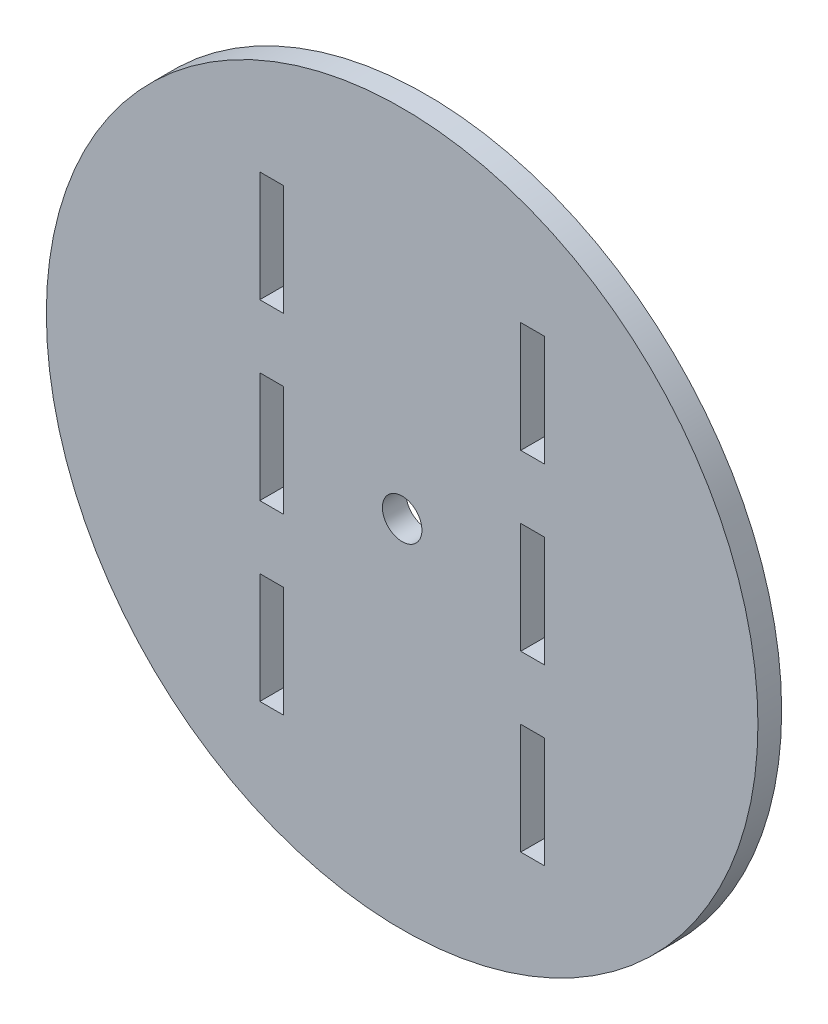
ISO-10303-21;
HEADER;
FILE_DESCRIPTION(('STEP AP214'),'2;1');
FILE_NAME('part.step','',(''),(''),'','','');
FILE_SCHEMA(('AUTOMOTIVE_DESIGN { 1 0 10303 214 1 1 1 1 }'));
ENDSEC;
DATA;
#1=APPLICATION_CONTEXT('core data for automotive mechanical design processes');
#2=APPLICATION_PROTOCOL_DEFINITION('international standard','automotive_design',2000,#1);
#3=PRODUCT_CONTEXT('',#1,'mechanical');
#4=PRODUCT('Part','Part','',(#3));
#5=PRODUCT_RELATED_PRODUCT_CATEGORY('part','',(#4));
#6=PRODUCT_DEFINITION_FORMATION('','',#4);
#7=PRODUCT_DEFINITION_CONTEXT('part definition',#1,'design');
#8=PRODUCT_DEFINITION('design','',#6,#7);
#9=PRODUCT_DEFINITION_SHAPE('','',#8);
#10=(LENGTH_UNIT() NAMED_UNIT(*) SI_UNIT(.MILLI.,.METRE.));
#11=(NAMED_UNIT(*) PLANE_ANGLE_UNIT() SI_UNIT($,.RADIAN.));
#12=(NAMED_UNIT(*) SI_UNIT($,.STERADIAN.) SOLID_ANGLE_UNIT());
#13=UNCERTAINTY_MEASURE_WITH_UNIT(LENGTH_MEASURE(1.E-05),#10,'distance_accuracy_value','');
#14=(GEOMETRIC_REPRESENTATION_CONTEXT(3) GLOBAL_UNCERTAINTY_ASSIGNED_CONTEXT((#13)) GLOBAL_UNIT_ASSIGNED_CONTEXT((#10,
#11,#12)) REPRESENTATION_CONTEXT('',''));
#15=CARTESIAN_POINT('',(0.,0.,0.));
#16=DIRECTION('',(0.,0.,1.));
#17=DIRECTION('',(1.,0.,0.));
#18=AXIS2_PLACEMENT_3D('',#15,#16,#17);
#19=CARTESIAN_POINT('',(45.,147.508099700188,3.));
#20=DIRECTION('',(0.,0.,1.));
#21=DIRECTION('',(1.,0.,0.));
#22=AXIS2_PLACEMENT_3D('',#19,#20,#21);
#23=PLANE('',#22);
#24=CARTESIAN_POINT('',(45.,147.508099700188,3.));
#25=DIRECTION('',(0.,0.,1.));
#26=DIRECTION('',(1.,0.,0.));
#27=AXIS2_PLACEMENT_3D('',#24,#25,#26);
#28=CIRCLE('',#27,45.);
#29=CARTESIAN_POINT('',(90.,147.508099700188,3.));
#30=VERTEX_POINT('',#29);
#31=EDGE_CURVE('E11',#30,#30,#28,.T.);
#32=ORIENTED_EDGE('',*,*,#31,.T.);
#33=EDGE_LOOP('',(#32));
#34=FACE_BOUND('',#33,.T.);
#35=DIRECTION('',(-1.,0.,0.));
#36=VECTOR('',#35,1.);
#37=CARTESIAN_POINT('',(45.,176.508099700188,3.));
#38=LINE('',#37,#36);
#39=CARTESIAN_POINT('',(63.,176.508099700188,3.));
#40=VERTEX_POINT('',#39);
#41=CARTESIAN_POINT('',(60.,176.508099700188,3.));
#42=VERTEX_POINT('',#41);
#43=EDGE_CURVE('E382',#40,#42,#38,.T.);
#44=ORIENTED_EDGE('',*,*,#43,.F.);
#45=DIRECTION('',(0.,1.,0.));
#46=VECTOR('',#45,1.);
#47=CARTESIAN_POINT('',(63.,147.508099700188,3.));
#48=LINE('',#47,#46);
#49=CARTESIAN_POINT('',(63.,162.508099700188,3.));
#50=VERTEX_POINT('',#49);
#51=EDGE_CURVE('E368',#50,#40,#48,.T.);
#52=ORIENTED_EDGE('',*,*,#51,.F.);
#53=DIRECTION('',(-1.,0.,0.));
#54=VECTOR('',#53,1.);
#55=CARTESIAN_POINT('',(45.,162.508099700188,3.));
#56=LINE('',#55,#54);
#57=CARTESIAN_POINT('',(60.,162.508099700188,3.));
#58=VERTEX_POINT('',#57);
#59=EDGE_CURVE('E376',#50,#58,#56,.T.);
#60=ORIENTED_EDGE('',*,*,#59,.T.);
#61=DIRECTION('',(0.,1.,0.));
#62=VECTOR('',#61,1.);
#63=CARTESIAN_POINT('',(60.,147.508099700188,3.));
#64=LINE('',#63,#62);
#65=EDGE_CURVE('E379',#58,#42,#64,.T.);
#66=ORIENTED_EDGE('',*,*,#65,.T.);
#67=EDGE_LOOP('',(#44,#52,#60,#66));
#68=FACE_BOUND('',#67,.T.);
#69=DIRECTION('',(1.,0.,0.));
#70=VECTOR('',#69,1.);
#71=CARTESIAN_POINT('',(45.,140.508099700188,3.));
#72=LINE('',#71,#70);
#73=CARTESIAN_POINT('',(60.,140.508099700188,3.));
#74=VERTEX_POINT('',#73);
#75=CARTESIAN_POINT('',(63.,140.508099700188,3.));
#76=VERTEX_POINT('',#75);
#77=EDGE_CURVE('E352',#74,#76,#72,.T.);
#78=ORIENTED_EDGE('',*,*,#77,.F.);
#79=DIRECTION('',(0.,-1.,0.));
#80=VECTOR('',#79,1.);
#81=CARTESIAN_POINT('',(60.,147.508099700188,3.));
#82=LINE('',#81,#80);
#83=CARTESIAN_POINT('',(60.,154.508099700188,3.));
#84=VERTEX_POINT('',#83);
#85=EDGE_CURVE('E345',#84,#74,#82,.T.);
#86=ORIENTED_EDGE('',*,*,#85,.F.);
#87=DIRECTION('',(-1.,0.,0.));
#88=VECTOR('',#87,1.);
#89=CARTESIAN_POINT('',(45.,154.508099700188,3.));
#90=LINE('',#89,#88);
#91=CARTESIAN_POINT('',(63.,154.508099700188,3.));
#92=VERTEX_POINT('',#91);
#93=EDGE_CURVE('E347',#92,#84,#90,.T.);
#94=ORIENTED_EDGE('',*,*,#93,.F.);
#95=DIRECTION('',(0.,1.,0.));
#96=VECTOR('',#95,1.);
#97=CARTESIAN_POINT('',(63.,147.508099700188,3.));
#98=LINE('',#97,#96);
#99=EDGE_CURVE('E350',#76,#92,#98,.T.);
#100=ORIENTED_EDGE('',*,*,#99,.F.);
#101=EDGE_LOOP('',(#78,#86,#94,#100));
#102=FACE_BOUND('',#101,.T.);
#103=DIRECTION('',(-1.,0.,0.));
#104=VECTOR('',#103,1.);
#105=CARTESIAN_POINT('',(45.,132.508099700188,3.));
#106=LINE('',#105,#104);
#107=CARTESIAN_POINT('',(63.,132.508099700188,3.));
#108=VERTEX_POINT('',#107);
#109=CARTESIAN_POINT('',(60.,132.508099700188,3.));
#110=VERTEX_POINT('',#109);
#111=EDGE_CURVE('E323',#108,#110,#106,.T.);
#112=ORIENTED_EDGE('',*,*,#111,.F.);
#113=DIRECTION('',(0.,1.,0.));
#114=VECTOR('',#113,1.);
#115=CARTESIAN_POINT('',(63.,147.508099700188,3.));
#116=LINE('',#115,#114);
#117=CARTESIAN_POINT('',(63.,118.508099700188,3.));
#118=VERTEX_POINT('',#117);
#119=EDGE_CURVE('E315',#118,#108,#116,.T.);
#120=ORIENTED_EDGE('',*,*,#119,.F.);
#121=DIRECTION('',(1.,0.,0.));
#122=VECTOR('',#121,1.);
#123=CARTESIAN_POINT('',(45.,118.508099700188,3.));
#124=LINE('',#123,#122);
#125=CARTESIAN_POINT('',(60.,118.508099700188,3.));
#126=VERTEX_POINT('',#125);
#127=EDGE_CURVE('E317',#126,#118,#124,.T.);
#128=ORIENTED_EDGE('',*,*,#127,.F.);
#129=DIRECTION('',(0.,1.,0.));
#130=VECTOR('',#129,1.);
#131=CARTESIAN_POINT('',(60.,147.508099700188,3.));
#132=LINE('',#131,#130);
#133=EDGE_CURVE('E320',#126,#110,#132,.T.);
#134=ORIENTED_EDGE('',*,*,#133,.T.);
#135=EDGE_LOOP('',(#112,#120,#128,#134));
#136=FACE_BOUND('',#135,.T.);
#137=DIRECTION('',(-1.,0.,0.));
#138=VECTOR('',#137,1.);
#139=CARTESIAN_POINT('',(45.,176.508099700188,3.));
#140=LINE('',#139,#138);
#141=CARTESIAN_POINT('',(30.,176.508099700188,3.));
#142=VERTEX_POINT('',#141);
#143=CARTESIAN_POINT('',(27.,176.508099700188,3.));
#144=VERTEX_POINT('',#143);
#145=EDGE_CURVE('E293',#142,#144,#140,.T.);
#146=ORIENTED_EDGE('',*,*,#145,.F.);
#147=DIRECTION('',(0.,1.,0.));
#148=VECTOR('',#147,1.);
#149=CARTESIAN_POINT('',(30.,147.508099700188,3.));
#150=LINE('',#149,#148);
#151=CARTESIAN_POINT('',(30.,162.508099700188,3.));
#152=VERTEX_POINT('',#151);
#153=EDGE_CURVE('E286',#152,#142,#150,.T.);
#154=ORIENTED_EDGE('',*,*,#153,.F.);
#155=DIRECTION('',(-1.,0.,0.));
#156=VECTOR('',#155,1.);
#157=CARTESIAN_POINT('',(45.,162.508099700188,3.));
#158=LINE('',#157,#156);
#159=CARTESIAN_POINT('',(27.,162.508099700188,3.));
#160=VERTEX_POINT('',#159);
#161=EDGE_CURVE('E288',#152,#160,#158,.T.);
#162=ORIENTED_EDGE('',*,*,#161,.T.);
#163=DIRECTION('',(0.,-1.,0.));
#164=VECTOR('',#163,1.);
#165=CARTESIAN_POINT('',(27.,147.508099700188,3.));
#166=LINE('',#165,#164);
#167=EDGE_CURVE('E291',#144,#160,#166,.T.);
#168=ORIENTED_EDGE('',*,*,#167,.F.);
#169=EDGE_LOOP('',(#146,#154,#162,#168));
#170=FACE_BOUND('',#169,.T.);
#171=DIRECTION('',(-1.,0.,0.));
#172=VECTOR('',#171,1.);
#173=CARTESIAN_POINT('',(45.,154.508099700188,3.));
#174=LINE('',#173,#172);
#175=CARTESIAN_POINT('',(30.,154.508099700188,3.));
#176=VERTEX_POINT('',#175);
#177=CARTESIAN_POINT('',(27.,154.508099700188,3.));
#178=VERTEX_POINT('',#177);
#179=EDGE_CURVE('E264',#176,#178,#174,.T.);
#180=ORIENTED_EDGE('',*,*,#179,.F.);
#181=DIRECTION('',(0.,1.,0.));
#182=VECTOR('',#181,1.);
#183=CARTESIAN_POINT('',(30.,147.508099700188,3.));
#184=LINE('',#183,#182);
#185=CARTESIAN_POINT('',(30.,140.508099700188,3.));
#186=VERTEX_POINT('',#185);
#187=EDGE_CURVE('E257',#186,#176,#184,.T.);
#188=ORIENTED_EDGE('',*,*,#187,.F.);
#189=DIRECTION('',(1.,0.,0.));
#190=VECTOR('',#189,1.);
#191=CARTESIAN_POINT('',(45.,140.508099700188,3.));
#192=LINE('',#191,#190);
#193=CARTESIAN_POINT('',(27.,140.508099700188,3.));
#194=VERTEX_POINT('',#193);
#195=EDGE_CURVE('E259',#194,#186,#192,.T.);
#196=ORIENTED_EDGE('',*,*,#195,.F.);
#197=DIRECTION('',(0.,-1.,0.));
#198=VECTOR('',#197,1.);
#199=CARTESIAN_POINT('',(27.,147.508099700188,3.));
#200=LINE('',#199,#198);
#201=EDGE_CURVE('E262',#178,#194,#200,.T.);
#202=ORIENTED_EDGE('',*,*,#201,.F.);
#203=EDGE_LOOP('',(#180,#188,#196,#202));
#204=FACE_BOUND('',#203,.T.);
#205=DIRECTION('',(-1.,0.,0.));
#206=VECTOR('',#205,1.);
#207=CARTESIAN_POINT('',(45.,132.508099700188,3.));
#208=LINE('',#207,#206);
#209=CARTESIAN_POINT('',(30.,132.508099700188,3.));
#210=VERTEX_POINT('',#209);
#211=CARTESIAN_POINT('',(27.,132.508099700188,3.));
#212=VERTEX_POINT('',#211);
#213=EDGE_CURVE('E205',#210,#212,#208,.T.);
#214=ORIENTED_EDGE('',*,*,#213,.F.);
#215=DIRECTION('',(0.,1.,0.));
#216=VECTOR('',#215,1.);
#217=CARTESIAN_POINT('',(30.,147.508099700188,3.));
#218=LINE('',#217,#216);
#219=CARTESIAN_POINT('',(30.,118.508099700188,3.));
#220=VERTEX_POINT('',#219);
#221=EDGE_CURVE('E225',#220,#210,#218,.T.);
#222=ORIENTED_EDGE('',*,*,#221,.F.);
#223=DIRECTION('',(-1.,0.,0.));
#224=VECTOR('',#223,1.);
#225=CARTESIAN_POINT('',(45.,118.508099700188,3.));
#226=LINE('',#225,#224);
#227=CARTESIAN_POINT('',(27.,118.508099700188,3.));
#228=VERTEX_POINT('',#227);
#229=EDGE_CURVE('E227',#220,#228,#226,.T.);
#230=ORIENTED_EDGE('',*,*,#229,.T.);
#231=DIRECTION('',(0.,1.,0.));
#232=VECTOR('',#231,1.);
#233=CARTESIAN_POINT('',(27.,147.508099700188,3.));
#234=LINE('',#233,#232);
#235=EDGE_CURVE('E234',#228,#212,#234,.T.);
#236=ORIENTED_EDGE('',*,*,#235,.T.);
#237=EDGE_LOOP('',(#214,#222,#230,#236));
#238=FACE_BOUND('',#237,.T.);
#239=CARTESIAN_POINT('',(45.,147.508099700188,3.));
#240=DIRECTION('',(0.,0.,1.));
#241=DIRECTION('',(1.,0.,0.));
#242=AXIS2_PLACEMENT_3D('',#239,#240,#241);
#243=CIRCLE('',#242,2.5);
#244=CARTESIAN_POINT('',(47.5,147.508099700188,3.));
#245=VERTEX_POINT('',#244);
#246=EDGE_CURVE('E209',#245,#245,#243,.F.);
#247=ORIENTED_EDGE('',*,*,#246,.T.);
#248=EDGE_LOOP('',(#247));
#249=FACE_BOUND('',#248,.T.);
#250=ADVANCED_FACE('F41',(#34,#68,#102,#136,#170,#204,#238,#249),#23,.T.);
#251=CARTESIAN_POINT('',(45.,147.508099700188,0.));
#252=DIRECTION('',(0.,0.,1.));
#253=DIRECTION('',(1.,0.,0.));
#254=AXIS2_PLACEMENT_3D('',#251,#252,#253);
#255=PLANE('',#254);
#256=DIRECTION('',(0.,-1.,0.));
#257=VECTOR('',#256,1.);
#258=CARTESIAN_POINT('',(30.,132.508099700188,0.));
#259=LINE('',#258,#257);
#260=CARTESIAN_POINT('',(30.,132.508099700188,0.));
#261=VERTEX_POINT('',#260);
#262=CARTESIAN_POINT('',(30.,118.508099700188,0.));
#263=VERTEX_POINT('',#262);
#264=EDGE_CURVE('E224',#261,#263,#259,.T.);
#265=ORIENTED_EDGE('',*,*,#264,.F.);
#266=DIRECTION('',(1.,0.,0.));
#267=VECTOR('',#266,1.);
#268=CARTESIAN_POINT('',(27.,132.508099700188,0.));
#269=LINE('',#268,#267);
#270=CARTESIAN_POINT('',(27.,132.508099700188,0.));
#271=VERTEX_POINT('',#270);
#272=EDGE_CURVE('E64',#271,#261,#269,.T.);
#273=ORIENTED_EDGE('',*,*,#272,.F.);
#274=DIRECTION('',(0.,-1.,0.));
#275=VECTOR('',#274,1.);
#276=CARTESIAN_POINT('',(27.,132.508099700188,0.));
#277=LINE('',#276,#275);
#278=CARTESIAN_POINT('',(27.,118.508099700188,0.));
#279=VERTEX_POINT('',#278);
#280=EDGE_CURVE('E212',#271,#279,#277,.T.);
#281=ORIENTED_EDGE('',*,*,#280,.T.);
#282=DIRECTION('',(1.,0.,0.));
#283=VECTOR('',#282,1.);
#284=CARTESIAN_POINT('',(27.,118.508099700188,0.));
#285=LINE('',#284,#283);
#286=EDGE_CURVE('E218',#279,#263,#285,.T.);
#287=ORIENTED_EDGE('',*,*,#286,.T.);
#288=EDGE_LOOP('',(#265,#273,#281,#287));
#289=FACE_BOUND('',#288,.T.);
#290=DIRECTION('',(0.,-1.,0.));
#291=VECTOR('',#290,1.);
#292=CARTESIAN_POINT('',(30.,154.508099700188,0.));
#293=LINE('',#292,#291);
#294=CARTESIAN_POINT('',(30.,154.508099700188,0.));
#295=VERTEX_POINT('',#294);
#296=CARTESIAN_POINT('',(30.,140.508099700188,0.));
#297=VERTEX_POINT('',#296);
#298=EDGE_CURVE('E252',#295,#297,#293,.T.);
#299=ORIENTED_EDGE('',*,*,#298,.F.);
#300=DIRECTION('',(1.,0.,0.));
#301=VECTOR('',#300,1.);
#302=CARTESIAN_POINT('',(27.,154.508099700188,0.));
#303=LINE('',#302,#301);
#304=CARTESIAN_POINT('',(27.,154.508099700188,0.));
#305=VERTEX_POINT('',#304);
#306=EDGE_CURVE('E255',#305,#295,#303,.T.);
#307=ORIENTED_EDGE('',*,*,#306,.F.);
#308=DIRECTION('',(0.,1.,0.));
#309=VECTOR('',#308,1.);
#310=CARTESIAN_POINT('',(27.,140.508099700188,0.));
#311=LINE('',#310,#309);
#312=CARTESIAN_POINT('',(27.,140.508099700188,0.));
#313=VERTEX_POINT('',#312);
#314=EDGE_CURVE('E241',#313,#305,#311,.T.);
#315=ORIENTED_EDGE('',*,*,#314,.F.);
#316=DIRECTION('',(-1.,0.,0.));
#317=VECTOR('',#316,1.);
#318=CARTESIAN_POINT('',(30.,140.508099700188,0.));
#319=LINE('',#318,#317);
#320=EDGE_CURVE('E249',#297,#313,#319,.T.);
#321=ORIENTED_EDGE('',*,*,#320,.F.);
#322=EDGE_LOOP('',(#299,#307,#315,#321));
#323=FACE_BOUND('',#322,.T.);
#324=DIRECTION('',(0.,-1.,0.));
#325=VECTOR('',#324,1.);
#326=CARTESIAN_POINT('',(30.,176.508099700188,0.));
#327=LINE('',#326,#325);
#328=CARTESIAN_POINT('',(30.,176.508099700188,0.));
#329=VERTEX_POINT('',#328);
#330=CARTESIAN_POINT('',(30.,162.508099700188,0.));
#331=VERTEX_POINT('',#330);
#332=EDGE_CURVE('E281',#329,#331,#327,.T.);
#333=ORIENTED_EDGE('',*,*,#332,.F.);
#334=DIRECTION('',(1.,0.,0.));
#335=VECTOR('',#334,1.);
#336=CARTESIAN_POINT('',(27.,176.508099700188,0.));
#337=LINE('',#336,#335);
#338=CARTESIAN_POINT('',(27.,176.508099700188,0.));
#339=VERTEX_POINT('',#338);
#340=EDGE_CURVE('E284',#339,#329,#337,.T.);
#341=ORIENTED_EDGE('',*,*,#340,.F.);
#342=DIRECTION('',(0.,1.,0.));
#343=VECTOR('',#342,1.);
#344=CARTESIAN_POINT('',(27.,162.508099700188,0.));
#345=LINE('',#344,#343);
#346=CARTESIAN_POINT('',(27.,162.508099700188,0.));
#347=VERTEX_POINT('',#346);
#348=EDGE_CURVE('E270',#347,#339,#345,.T.);
#349=ORIENTED_EDGE('',*,*,#348,.F.);
#350=DIRECTION('',(1.,0.,0.));
#351=VECTOR('',#350,1.);
#352=CARTESIAN_POINT('',(27.,162.508099700188,0.));
#353=LINE('',#352,#351);
#354=EDGE_CURVE('E278',#347,#331,#353,.T.);
#355=ORIENTED_EDGE('',*,*,#354,.T.);
#356=EDGE_LOOP('',(#333,#341,#349,#355));
#357=FACE_BOUND('',#356,.T.);
#358=DIRECTION('',(0.,-1.,0.));
#359=VECTOR('',#358,1.);
#360=CARTESIAN_POINT('',(63.,132.508099700188,0.));
#361=LINE('',#360,#359);
#362=CARTESIAN_POINT('',(63.,132.508099700188,0.));
#363=VERTEX_POINT('',#362);
#364=CARTESIAN_POINT('',(63.,118.508099700188,0.));
#365=VERTEX_POINT('',#364);
#366=EDGE_CURVE('E310',#363,#365,#361,.T.);
#367=ORIENTED_EDGE('',*,*,#366,.F.);
#368=DIRECTION('',(1.,0.,0.));
#369=VECTOR('',#368,1.);
#370=CARTESIAN_POINT('',(60.,132.508099700188,0.));
#371=LINE('',#370,#369);
#372=CARTESIAN_POINT('',(60.,132.508099700188,0.));
#373=VERTEX_POINT('',#372);
#374=EDGE_CURVE('E313',#373,#363,#371,.T.);
#375=ORIENTED_EDGE('',*,*,#374,.F.);
#376=DIRECTION('',(0.,-1.,0.));
#377=VECTOR('',#376,1.);
#378=CARTESIAN_POINT('',(60.,132.508099700188,0.));
#379=LINE('',#378,#377);
#380=CARTESIAN_POINT('',(60.,118.508099700188,0.));
#381=VERTEX_POINT('',#380);
#382=EDGE_CURVE('E299',#373,#381,#379,.T.);
#383=ORIENTED_EDGE('',*,*,#382,.T.);
#384=DIRECTION('',(-1.,0.,0.));
#385=VECTOR('',#384,1.);
#386=CARTESIAN_POINT('',(63.,118.508099700188,0.));
#387=LINE('',#386,#385);
#388=EDGE_CURVE('E307',#365,#381,#387,.T.);
#389=ORIENTED_EDGE('',*,*,#388,.F.);
#390=EDGE_LOOP('',(#367,#375,#383,#389));
#391=FACE_BOUND('',#390,.T.);
#392=DIRECTION('',(0.,1.,0.));
#393=VECTOR('',#392,1.);
#394=CARTESIAN_POINT('',(60.,140.508099700188,0.));
#395=LINE('',#394,#393);
#396=CARTESIAN_POINT('',(60.,140.508099700188,0.));
#397=VERTEX_POINT('',#396);
#398=CARTESIAN_POINT('',(60.,154.508099700188,0.));
#399=VERTEX_POINT('',#398);
#400=EDGE_CURVE('E340',#397,#399,#395,.T.);
#401=ORIENTED_EDGE('',*,*,#400,.F.);
#402=DIRECTION('',(-1.,0.,0.));
#403=VECTOR('',#402,1.);
#404=CARTESIAN_POINT('',(63.,140.508099700188,0.));
#405=LINE('',#404,#403);
#406=CARTESIAN_POINT('',(63.,140.508099700188,0.));
#407=VERTEX_POINT('',#406);
#408=EDGE_CURVE('E343',#407,#397,#405,.T.);
#409=ORIENTED_EDGE('',*,*,#408,.F.);
#410=DIRECTION('',(0.,-1.,0.));
#411=VECTOR('',#410,1.);
#412=CARTESIAN_POINT('',(63.,154.508099700188,0.));
#413=LINE('',#412,#411);
#414=CARTESIAN_POINT('',(63.,154.508099700188,0.));
#415=VERTEX_POINT('',#414);
#416=EDGE_CURVE('E329',#415,#407,#413,.T.);
#417=ORIENTED_EDGE('',*,*,#416,.F.);
#418=DIRECTION('',(1.,0.,0.));
#419=VECTOR('',#418,1.);
#420=CARTESIAN_POINT('',(60.,154.508099700188,0.));
#421=LINE('',#420,#419);
#422=EDGE_CURVE('E337',#399,#415,#421,.T.);
#423=ORIENTED_EDGE('',*,*,#422,.F.);
#424=EDGE_LOOP('',(#401,#409,#417,#423));
#425=FACE_BOUND('',#424,.T.);
#426=DIRECTION('',(0.,-1.,0.));
#427=VECTOR('',#426,1.);
#428=CARTESIAN_POINT('',(63.,176.508099700188,0.));
#429=LINE('',#428,#427);
#430=CARTESIAN_POINT('',(63.,176.508099700188,0.));
#431=VERTEX_POINT('',#430);
#432=CARTESIAN_POINT('',(63.,162.508099700188,0.));
#433=VERTEX_POINT('',#432);
#434=EDGE_CURVE('E356',#431,#433,#429,.T.);
#435=ORIENTED_EDGE('',*,*,#434,.F.);
#436=DIRECTION('',(1.,0.,0.));
#437=VECTOR('',#436,1.);
#438=CARTESIAN_POINT('',(60.,176.508099700188,0.));
#439=LINE('',#438,#437);
#440=CARTESIAN_POINT('',(60.,176.508099700188,0.));
#441=VERTEX_POINT('',#440);
#442=EDGE_CURVE('E354',#441,#431,#439,.T.);
#443=ORIENTED_EDGE('',*,*,#442,.F.);
#444=DIRECTION('',(0.,-1.,0.));
#445=VECTOR('',#444,1.);
#446=CARTESIAN_POINT('',(60.,176.508099700188,0.));
#447=LINE('',#446,#445);
#448=CARTESIAN_POINT('',(60.,162.508099700188,0.));
#449=VERTEX_POINT('',#448);
#450=EDGE_CURVE('E362',#441,#449,#447,.T.);
#451=ORIENTED_EDGE('',*,*,#450,.T.);
#452=DIRECTION('',(1.,0.,0.));
#453=VECTOR('',#452,1.);
#454=CARTESIAN_POINT('',(60.,162.508099700188,0.));
#455=LINE('',#454,#453);
#456=EDGE_CURVE('E359',#449,#433,#455,.T.);
#457=ORIENTED_EDGE('',*,*,#456,.T.);
#458=EDGE_LOOP('',(#435,#443,#451,#457));
#459=FACE_BOUND('',#458,.T.);
#460=CARTESIAN_POINT('',(45.,147.508099700188,0.));
#461=DIRECTION('',(0.,0.,1.));
#462=DIRECTION('',(1.,0.,0.));
#463=AXIS2_PLACEMENT_3D('',#460,#461,#462);
#464=CIRCLE('',#463,45.);
#465=CARTESIAN_POINT('',(90.,147.508099700188,0.));
#466=VERTEX_POINT('',#465);
#467=EDGE_CURVE('E45',#466,#466,#464,.T.);
#468=ORIENTED_EDGE('',*,*,#467,.F.);
#469=EDGE_LOOP('',(#468));
#470=FACE_BOUND('',#469,.T.);
#471=CARTESIAN_POINT('',(45.,147.508099700188,0.));
#472=DIRECTION('',(0.,0.,1.));
#473=DIRECTION('',(1.,0.,0.));
#474=AXIS2_PLACEMENT_3D('',#471,#472,#473);
#475=CIRCLE('',#474,2.5);
#476=CARTESIAN_POINT('',(47.5,147.508099700188,0.));
#477=VERTEX_POINT('',#476);
#478=EDGE_CURVE('E395',#477,#477,#475,.T.);
#479=ORIENTED_EDGE('',*,*,#478,.T.);
#480=EDGE_LOOP('',(#479));
#481=FACE_BOUND('',#480,.T.);
#482=ADVANCED_FACE('F222',(#289,#323,#357,#391,#425,#459,#470,#481),#255,.F.);
#483=CARTESIAN_POINT('',(45.,147.508099700188,3.));
#484=DIRECTION('',(0.,0.,-1.));
#485=DIRECTION('',(-1.,0.,0.));
#486=AXIS2_PLACEMENT_3D('',#483,#484,#485);
#487=CYLINDRICAL_SURFACE('',#486,45.);
#488=ORIENTED_EDGE('',*,*,#31,.F.);
#489=EDGE_LOOP('',(#488));
#490=FACE_BOUND('',#489,.T.);
#491=ORIENTED_EDGE('',*,*,#467,.T.);
#492=EDGE_LOOP('',(#491));
#493=FACE_BOUND('',#492,.T.);
#494=ADVANCED_FACE('F43',(#490,#493),#487,.T.);
#495=CARTESIAN_POINT('',(60.,176.508099700188,35.));
#496=DIRECTION('',(0.,1.,0.));
#497=DIRECTION('',(0.,0.,1.));
#498=AXIS2_PLACEMENT_3D('',#495,#496,#497);
#499=PLANE('',#498);
#500=ORIENTED_EDGE('',*,*,#43,.T.);
#501=DIRECTION('',(0.,0.,-1.));
#502=VECTOR('',#501,1.);
#503=CARTESIAN_POINT('',(60.,176.508099700188,35.));
#504=LINE('',#503,#502);
#505=EDGE_CURVE('E366',#42,#441,#504,.T.);
#506=ORIENTED_EDGE('',*,*,#505,.T.);
#507=ORIENTED_EDGE('',*,*,#442,.T.);
#508=DIRECTION('',(0.,0.,-1.));
#509=VECTOR('',#508,1.);
#510=CARTESIAN_POINT('',(63.,176.508099700188,35.));
#511=LINE('',#510,#509);
#512=EDGE_CURVE('E365',#40,#431,#511,.T.);
#513=ORIENTED_EDGE('',*,*,#512,.F.);
#514=EDGE_LOOP('',(#500,#506,#507,#513));
#515=FACE_BOUND('',#514,.T.);
#516=ADVANCED_FACE('F497',(#515),#499,.F.);
#517=CARTESIAN_POINT('',(60.,176.508099700188,35.));
#518=DIRECTION('',(1.,0.,0.));
#519=DIRECTION('',(0.,1.,0.));
#520=AXIS2_PLACEMENT_3D('',#517,#518,#519);
#521=PLANE('',#520);
#522=DIRECTION('',(0.,0.,-1.));
#523=VECTOR('',#522,1.);
#524=CARTESIAN_POINT('',(60.,162.508099700188,35.));
#525=LINE('',#524,#523);
#526=EDGE_CURVE('E369',#58,#449,#525,.T.);
#527=ORIENTED_EDGE('',*,*,#526,.T.);
#528=ORIENTED_EDGE('',*,*,#450,.F.);
#529=ORIENTED_EDGE('',*,*,#505,.F.);
#530=ORIENTED_EDGE('',*,*,#65,.F.);
#531=EDGE_LOOP('',(#527,#528,#529,#530));
#532=FACE_BOUND('',#531,.T.);
#533=ADVANCED_FACE('F493',(#532),#521,.T.);
#534=CARTESIAN_POINT('',(60.,162.508099700188,35.));
#535=DIRECTION('',(0.,1.,0.));
#536=DIRECTION('',(0.,0.,1.));
#537=AXIS2_PLACEMENT_3D('',#534,#535,#536);
#538=PLANE('',#537);
#539=DIRECTION('',(0.,0.,-1.));
#540=VECTOR('',#539,1.);
#541=CARTESIAN_POINT('',(63.,162.508099700188,35.));
#542=LINE('',#541,#540);
#543=EDGE_CURVE('E371',#50,#433,#542,.T.);
#544=ORIENTED_EDGE('',*,*,#543,.T.);
#545=ORIENTED_EDGE('',*,*,#456,.F.);
#546=ORIENTED_EDGE('',*,*,#526,.F.);
#547=ORIENTED_EDGE('',*,*,#59,.F.);
#548=EDGE_LOOP('',(#544,#545,#546,#547));
#549=FACE_BOUND('',#548,.T.);
#550=ADVANCED_FACE('F496',(#549),#538,.T.);
#551=CARTESIAN_POINT('',(63.,176.508099700188,35.));
#552=DIRECTION('',(1.,0.,0.));
#553=DIRECTION('',(0.,1.,0.));
#554=AXIS2_PLACEMENT_3D('',#551,#552,#553);
#555=PLANE('',#554);
#556=ORIENTED_EDGE('',*,*,#51,.T.);
#557=ORIENTED_EDGE('',*,*,#512,.T.);
#558=ORIENTED_EDGE('',*,*,#434,.T.);
#559=ORIENTED_EDGE('',*,*,#543,.F.);
#560=EDGE_LOOP('',(#556,#557,#558,#559));
#561=FACE_BOUND('',#560,.T.);
#562=ADVANCED_FACE('F481',(#561),#555,.F.);
#563=CARTESIAN_POINT('',(63.,140.508099700188,35.));
#564=DIRECTION('',(0.,-1.,0.));
#565=DIRECTION('',(0.,0.,-1.));
#566=AXIS2_PLACEMENT_3D('',#563,#564,#565);
#567=PLANE('',#566);
#568=ORIENTED_EDGE('',*,*,#77,.T.);
#569=DIRECTION('',(0.,0.,-1.));
#570=VECTOR('',#569,1.);
#571=CARTESIAN_POINT('',(63.,140.508099700188,35.));
#572=LINE('',#571,#570);
#573=EDGE_CURVE('E325',#76,#407,#572,.T.);
#574=ORIENTED_EDGE('',*,*,#573,.T.);
#575=ORIENTED_EDGE('',*,*,#408,.T.);
#576=DIRECTION('',(0.,0.,-1.));
#577=VECTOR('',#576,1.);
#578=CARTESIAN_POINT('',(60.,140.508099700188,35.));
#579=LINE('',#578,#577);
#580=EDGE_CURVE('E326',#74,#397,#579,.T.);
#581=ORIENTED_EDGE('',*,*,#580,.F.);
#582=EDGE_LOOP('',(#568,#574,#575,#581));
#583=FACE_BOUND('',#582,.T.);
#584=ADVANCED_FACE('F477',(#583),#567,.F.);
#585=CARTESIAN_POINT('',(63.,154.508099700188,35.));
#586=DIRECTION('',(1.,0.,0.));
#587=DIRECTION('',(0.,0.,-1.));
#588=AXIS2_PLACEMENT_3D('',#585,#586,#587);
#589=PLANE('',#588);
#590=ORIENTED_EDGE('',*,*,#99,.T.);
#591=DIRECTION('',(0.,0.,-1.));
#592=VECTOR('',#591,1.);
#593=CARTESIAN_POINT('',(63.,154.508099700188,35.));
#594=LINE('',#593,#592);
#595=EDGE_CURVE('E332',#92,#415,#594,.T.);
#596=ORIENTED_EDGE('',*,*,#595,.T.);
#597=ORIENTED_EDGE('',*,*,#416,.T.);
#598=ORIENTED_EDGE('',*,*,#573,.F.);
#599=EDGE_LOOP('',(#590,#596,#597,#598));
#600=FACE_BOUND('',#599,.T.);
#601=ADVANCED_FACE('F480',(#600),#589,.F.);
#602=CARTESIAN_POINT('',(60.,154.508099700188,35.));
#603=DIRECTION('',(0.,1.,0.));
#604=DIRECTION('',(0.,0.,1.));
#605=AXIS2_PLACEMENT_3D('',#602,#603,#604);
#606=PLANE('',#605);
#607=ORIENTED_EDGE('',*,*,#93,.T.);
#608=DIRECTION('',(0.,0.,-1.));
#609=VECTOR('',#608,1.);
#610=CARTESIAN_POINT('',(60.,154.508099700188,35.));
#611=LINE('',#610,#609);
#612=EDGE_CURVE('E330',#84,#399,#611,.T.);
#613=ORIENTED_EDGE('',*,*,#612,.T.);
#614=ORIENTED_EDGE('',*,*,#422,.T.);
#615=ORIENTED_EDGE('',*,*,#595,.F.);
#616=EDGE_LOOP('',(#607,#613,#614,#615));
#617=FACE_BOUND('',#616,.T.);
#618=ADVANCED_FACE('F485',(#617),#606,.F.);
#619=CARTESIAN_POINT('',(60.,140.508099700188,35.));
#620=DIRECTION('',(-1.,0.,0.));
#621=DIRECTION('',(0.,0.,1.));
#622=AXIS2_PLACEMENT_3D('',#619,#620,#621);
#623=PLANE('',#622);
#624=ORIENTED_EDGE('',*,*,#85,.T.);
#625=ORIENTED_EDGE('',*,*,#580,.T.);
#626=ORIENTED_EDGE('',*,*,#400,.T.);
#627=ORIENTED_EDGE('',*,*,#612,.F.);
#628=EDGE_LOOP('',(#624,#625,#626,#627));
#629=FACE_BOUND('',#628,.T.);
#630=ADVANCED_FACE('F465',(#629),#623,.F.);
#631=CARTESIAN_POINT('',(60.,132.508099700188,35.));
#632=DIRECTION('',(0.,1.,0.));
#633=DIRECTION('',(0.,0.,1.));
#634=AXIS2_PLACEMENT_3D('',#631,#632,#633);
#635=PLANE('',#634);
#636=ORIENTED_EDGE('',*,*,#111,.T.);
#637=DIRECTION('',(0.,0.,-1.));
#638=VECTOR('',#637,1.);
#639=CARTESIAN_POINT('',(60.,132.508099700188,35.));
#640=LINE('',#639,#638);
#641=EDGE_CURVE('E295',#110,#373,#640,.T.);
#642=ORIENTED_EDGE('',*,*,#641,.T.);
#643=ORIENTED_EDGE('',*,*,#374,.T.);
#644=DIRECTION('',(0.,0.,-1.));
#645=VECTOR('',#644,1.);
#646=CARTESIAN_POINT('',(63.,132.508099700188,35.));
#647=LINE('',#646,#645);
#648=EDGE_CURVE('E296',#108,#363,#647,.T.);
#649=ORIENTED_EDGE('',*,*,#648,.F.);
#650=EDGE_LOOP('',(#636,#642,#643,#649));
#651=FACE_BOUND('',#650,.T.);
#652=ADVANCED_FACE('F461',(#651),#635,.F.);
#653=CARTESIAN_POINT('',(60.,132.508099700188,35.));
#654=DIRECTION('',(1.,0.,0.));
#655=DIRECTION('',(0.,0.,-1.));
#656=AXIS2_PLACEMENT_3D('',#653,#654,#655);
#657=PLANE('',#656);
#658=DIRECTION('',(0.,0.,-1.));
#659=VECTOR('',#658,1.);
#660=CARTESIAN_POINT('',(60.,118.508099700188,35.));
#661=LINE('',#660,#659);
#662=EDGE_CURVE('E302',#126,#381,#661,.T.);
#663=ORIENTED_EDGE('',*,*,#662,.T.);
#664=ORIENTED_EDGE('',*,*,#382,.F.);
#665=ORIENTED_EDGE('',*,*,#641,.F.);
#666=ORIENTED_EDGE('',*,*,#133,.F.);
#667=EDGE_LOOP('',(#663,#664,#665,#666));
#668=FACE_BOUND('',#667,.T.);
#669=ADVANCED_FACE('F464',(#668),#657,.T.);
#670=CARTESIAN_POINT('',(63.,118.508099700188,35.));
#671=DIRECTION('',(0.,-1.,0.));
#672=DIRECTION('',(0.,0.,-1.));
#673=AXIS2_PLACEMENT_3D('',#670,#671,#672);
#674=PLANE('',#673);
#675=ORIENTED_EDGE('',*,*,#127,.T.);
#676=DIRECTION('',(0.,0.,-1.));
#677=VECTOR('',#676,1.);
#678=CARTESIAN_POINT('',(63.,118.508099700188,35.));
#679=LINE('',#678,#677);
#680=EDGE_CURVE('E300',#118,#365,#679,.T.);
#681=ORIENTED_EDGE('',*,*,#680,.T.);
#682=ORIENTED_EDGE('',*,*,#388,.T.);
#683=ORIENTED_EDGE('',*,*,#662,.F.);
#684=EDGE_LOOP('',(#675,#681,#682,#683));
#685=FACE_BOUND('',#684,.T.);
#686=ADVANCED_FACE('F469',(#685),#674,.F.);
#687=CARTESIAN_POINT('',(63.,132.508099700188,35.));
#688=DIRECTION('',(1.,0.,0.));
#689=DIRECTION('',(0.,0.,-1.));
#690=AXIS2_PLACEMENT_3D('',#687,#688,#689);
#691=PLANE('',#690);
#692=ORIENTED_EDGE('',*,*,#119,.T.);
#693=ORIENTED_EDGE('',*,*,#648,.T.);
#694=ORIENTED_EDGE('',*,*,#366,.T.);
#695=ORIENTED_EDGE('',*,*,#680,.F.);
#696=EDGE_LOOP('',(#692,#693,#694,#695));
#697=FACE_BOUND('',#696,.T.);
#698=ADVANCED_FACE('F449',(#697),#691,.F.);
#699=CARTESIAN_POINT('',(27.,176.508099700188,35.));
#700=DIRECTION('',(0.,1.,0.));
#701=DIRECTION('',(0.,0.,1.));
#702=AXIS2_PLACEMENT_3D('',#699,#700,#701);
#703=PLANE('',#702);
#704=ORIENTED_EDGE('',*,*,#145,.T.);
#705=DIRECTION('',(0.,0.,-1.));
#706=VECTOR('',#705,1.);
#707=CARTESIAN_POINT('',(27.,176.508099700188,35.));
#708=LINE('',#707,#706);
#709=EDGE_CURVE('E266',#144,#339,#708,.T.);
#710=ORIENTED_EDGE('',*,*,#709,.T.);
#711=ORIENTED_EDGE('',*,*,#340,.T.);
#712=DIRECTION('',(0.,0.,-1.));
#713=VECTOR('',#712,1.);
#714=CARTESIAN_POINT('',(30.,176.508099700188,35.));
#715=LINE('',#714,#713);
#716=EDGE_CURVE('E267',#142,#329,#715,.T.);
#717=ORIENTED_EDGE('',*,*,#716,.F.);
#718=EDGE_LOOP('',(#704,#710,#711,#717));
#719=FACE_BOUND('',#718,.T.);
#720=ADVANCED_FACE('F445',(#719),#703,.F.);
#721=CARTESIAN_POINT('',(27.,162.508099700188,35.));
#722=DIRECTION('',(-1.,0.,0.));
#723=DIRECTION('',(0.,0.,1.));
#724=AXIS2_PLACEMENT_3D('',#721,#722,#723);
#725=PLANE('',#724);
#726=ORIENTED_EDGE('',*,*,#167,.T.);
#727=DIRECTION('',(0.,0.,-1.));
#728=VECTOR('',#727,1.);
#729=CARTESIAN_POINT('',(27.,162.508099700188,35.));
#730=LINE('',#729,#728);
#731=EDGE_CURVE('E273',#160,#347,#730,.T.);
#732=ORIENTED_EDGE('',*,*,#731,.T.);
#733=ORIENTED_EDGE('',*,*,#348,.T.);
#734=ORIENTED_EDGE('',*,*,#709,.F.);
#735=EDGE_LOOP('',(#726,#732,#733,#734));
#736=FACE_BOUND('',#735,.T.);
#737=ADVANCED_FACE('F448',(#736),#725,.F.);
#738=CARTESIAN_POINT('',(27.,162.508099700188,35.));
#739=DIRECTION('',(0.,1.,0.));
#740=DIRECTION('',(0.,0.,1.));
#741=AXIS2_PLACEMENT_3D('',#738,#739,#740);
#742=PLANE('',#741);
#743=DIRECTION('',(0.,0.,-1.));
#744=VECTOR('',#743,1.);
#745=CARTESIAN_POINT('',(30.,162.508099700188,35.));
#746=LINE('',#745,#744);
#747=EDGE_CURVE('E271',#152,#331,#746,.T.);
#748=ORIENTED_EDGE('',*,*,#747,.T.);
#749=ORIENTED_EDGE('',*,*,#354,.F.);
#750=ORIENTED_EDGE('',*,*,#731,.F.);
#751=ORIENTED_EDGE('',*,*,#161,.F.);
#752=EDGE_LOOP('',(#748,#749,#750,#751));
#753=FACE_BOUND('',#752,.T.);
#754=ADVANCED_FACE('F453',(#753),#742,.T.);
#755=CARTESIAN_POINT('',(30.,176.508099700188,35.));
#756=DIRECTION('',(1.,0.,0.));
#757=DIRECTION('',(0.,0.,-1.));
#758=AXIS2_PLACEMENT_3D('',#755,#756,#757);
#759=PLANE('',#758);
#760=ORIENTED_EDGE('',*,*,#153,.T.);
#761=ORIENTED_EDGE('',*,*,#716,.T.);
#762=ORIENTED_EDGE('',*,*,#332,.T.);
#763=ORIENTED_EDGE('',*,*,#747,.F.);
#764=EDGE_LOOP('',(#760,#761,#762,#763));
#765=FACE_BOUND('',#764,.T.);
#766=ADVANCED_FACE('F433',(#765),#759,.F.);
#767=CARTESIAN_POINT('',(27.,154.508099700188,35.));
#768=DIRECTION('',(0.,1.,0.));
#769=DIRECTION('',(0.,0.,1.));
#770=AXIS2_PLACEMENT_3D('',#767,#768,#769);
#771=PLANE('',#770);
#772=ORIENTED_EDGE('',*,*,#179,.T.);
#773=DIRECTION('',(0.,0.,-1.));
#774=VECTOR('',#773,1.);
#775=CARTESIAN_POINT('',(27.,154.508099700188,35.));
#776=LINE('',#775,#774);
#777=EDGE_CURVE('E237',#178,#305,#776,.T.);
#778=ORIENTED_EDGE('',*,*,#777,.T.);
#779=ORIENTED_EDGE('',*,*,#306,.T.);
#780=DIRECTION('',(0.,0.,-1.));
#781=VECTOR('',#780,1.);
#782=CARTESIAN_POINT('',(30.,154.508099700188,35.));
#783=LINE('',#782,#781);
#784=EDGE_CURVE('E238',#176,#295,#783,.T.);
#785=ORIENTED_EDGE('',*,*,#784,.F.);
#786=EDGE_LOOP('',(#772,#778,#779,#785));
#787=FACE_BOUND('',#786,.T.);
#788=ADVANCED_FACE('F429',(#787),#771,.F.);
#789=CARTESIAN_POINT('',(27.,140.508099700188,35.));
#790=DIRECTION('',(-1.,0.,0.));
#791=DIRECTION('',(0.,0.,1.));
#792=AXIS2_PLACEMENT_3D('',#789,#790,#791);
#793=PLANE('',#792);
#794=ORIENTED_EDGE('',*,*,#201,.T.);
#795=DIRECTION('',(0.,0.,-1.));
#796=VECTOR('',#795,1.);
#797=CARTESIAN_POINT('',(27.,140.508099700188,35.));
#798=LINE('',#797,#796);
#799=EDGE_CURVE('E244',#194,#313,#798,.T.);
#800=ORIENTED_EDGE('',*,*,#799,.T.);
#801=ORIENTED_EDGE('',*,*,#314,.T.);
#802=ORIENTED_EDGE('',*,*,#777,.F.);
#803=EDGE_LOOP('',(#794,#800,#801,#802));
#804=FACE_BOUND('',#803,.T.);
#805=ADVANCED_FACE('F432',(#804),#793,.F.);
#806=CARTESIAN_POINT('',(30.,140.508099700188,35.));
#807=DIRECTION('',(0.,-1.,0.));
#808=DIRECTION('',(0.,0.,-1.));
#809=AXIS2_PLACEMENT_3D('',#806,#807,#808);
#810=PLANE('',#809);
#811=ORIENTED_EDGE('',*,*,#195,.T.);
#812=DIRECTION('',(0.,0.,-1.));
#813=VECTOR('',#812,1.);
#814=CARTESIAN_POINT('',(30.,140.508099700188,35.));
#815=LINE('',#814,#813);
#816=EDGE_CURVE('E242',#186,#297,#815,.T.);
#817=ORIENTED_EDGE('',*,*,#816,.T.);
#818=ORIENTED_EDGE('',*,*,#320,.T.);
#819=ORIENTED_EDGE('',*,*,#799,.F.);
#820=EDGE_LOOP('',(#811,#817,#818,#819));
#821=FACE_BOUND('',#820,.T.);
#822=ADVANCED_FACE('F437',(#821),#810,.F.);
#823=CARTESIAN_POINT('',(30.,154.508099700188,35.));
#824=DIRECTION('',(1.,0.,0.));
#825=DIRECTION('',(0.,0.,-1.));
#826=AXIS2_PLACEMENT_3D('',#823,#824,#825);
#827=PLANE('',#826);
#828=ORIENTED_EDGE('',*,*,#187,.T.);
#829=ORIENTED_EDGE('',*,*,#784,.T.);
#830=ORIENTED_EDGE('',*,*,#298,.T.);
#831=ORIENTED_EDGE('',*,*,#816,.F.);
#832=EDGE_LOOP('',(#828,#829,#830,#831));
#833=FACE_BOUND('',#832,.T.);
#834=ADVANCED_FACE('F423',(#833),#827,.F.);
#835=CARTESIAN_POINT('',(27.,132.508099700188,35.));
#836=DIRECTION('',(0.,1.,0.));
#837=DIRECTION('',(0.,0.,1.));
#838=AXIS2_PLACEMENT_3D('',#835,#836,#837);
#839=PLANE('',#838);
#840=ORIENTED_EDGE('',*,*,#213,.T.);
#841=DIRECTION('',(0.,0.,-1.));
#842=VECTOR('',#841,1.);
#843=CARTESIAN_POINT('',(27.,132.508099700188,35.));
#844=LINE('',#843,#842);
#845=EDGE_CURVE('E201',#212,#271,#844,.T.);
#846=ORIENTED_EDGE('',*,*,#845,.T.);
#847=ORIENTED_EDGE('',*,*,#272,.T.);
#848=DIRECTION('',(0.,0.,-1.));
#849=VECTOR('',#848,1.);
#850=CARTESIAN_POINT('',(30.,132.508099700188,35.));
#851=LINE('',#850,#849);
#852=EDGE_CURVE('E219',#210,#261,#851,.T.);
#853=ORIENTED_EDGE('',*,*,#852,.F.);
#854=EDGE_LOOP('',(#840,#846,#847,#853));
#855=FACE_BOUND('',#854,.T.);
#856=ADVANCED_FACE('F203',(#855),#839,.F.);
#857=CARTESIAN_POINT('',(27.,132.508099700188,35.));
#858=DIRECTION('',(1.,0.,0.));
#859=DIRECTION('',(0.,0.,-1.));
#860=AXIS2_PLACEMENT_3D('',#857,#858,#859);
#861=PLANE('',#860);
#862=DIRECTION('',(0.,0.,-1.));
#863=VECTOR('',#862,1.);
#864=CARTESIAN_POINT('',(27.,118.508099700188,35.));
#865=LINE('',#864,#863);
#866=EDGE_CURVE('E208',#228,#279,#865,.T.);
#867=ORIENTED_EDGE('',*,*,#866,.T.);
#868=ORIENTED_EDGE('',*,*,#280,.F.);
#869=ORIENTED_EDGE('',*,*,#845,.F.);
#870=ORIENTED_EDGE('',*,*,#235,.F.);
#871=EDGE_LOOP('',(#867,#868,#869,#870));
#872=FACE_BOUND('',#871,.T.);
#873=ADVANCED_FACE('F213',(#872),#861,.T.);
#874=CARTESIAN_POINT('',(27.,118.508099700188,35.));
#875=DIRECTION('',(0.,1.,0.));
#876=DIRECTION('',(0.,0.,1.));
#877=AXIS2_PLACEMENT_3D('',#874,#875,#876);
#878=PLANE('',#877);
#879=DIRECTION('',(0.,0.,-1.));
#880=VECTOR('',#879,1.);
#881=CARTESIAN_POINT('',(30.,118.508099700188,35.));
#882=LINE('',#881,#880);
#883=EDGE_CURVE('E56',#220,#263,#882,.T.);
#884=ORIENTED_EDGE('',*,*,#883,.T.);
#885=ORIENTED_EDGE('',*,*,#286,.F.);
#886=ORIENTED_EDGE('',*,*,#866,.F.);
#887=ORIENTED_EDGE('',*,*,#229,.F.);
#888=EDGE_LOOP('',(#884,#885,#886,#887));
#889=FACE_BOUND('',#888,.T.);
#890=ADVANCED_FACE('F404',(#889),#878,.T.);
#891=CARTESIAN_POINT('',(30.,132.508099700188,35.));
#892=DIRECTION('',(1.,0.,0.));
#893=DIRECTION('',(0.,0.,-1.));
#894=AXIS2_PLACEMENT_3D('',#891,#892,#893);
#895=PLANE('',#894);
#896=ORIENTED_EDGE('',*,*,#221,.T.);
#897=ORIENTED_EDGE('',*,*,#852,.T.);
#898=ORIENTED_EDGE('',*,*,#264,.T.);
#899=ORIENTED_EDGE('',*,*,#883,.F.);
#900=EDGE_LOOP('',(#896,#897,#898,#899));
#901=FACE_BOUND('',#900,.T.);
#902=ADVANCED_FACE('F406',(#901),#895,.F.);
#903=CARTESIAN_POINT('',(45.,147.508099700188,35.));
#904=DIRECTION('',(0.,0.,-1.));
#905=DIRECTION('',(-1.,0.,0.));
#906=AXIS2_PLACEMENT_3D('',#903,#904,#905);
#907=CYLINDRICAL_SURFACE('',#906,2.5);
#908=ORIENTED_EDGE('',*,*,#246,.F.);
#909=EDGE_LOOP('',(#908));
#910=FACE_BOUND('',#909,.T.);
#911=ORIENTED_EDGE('',*,*,#478,.F.);
#912=EDGE_LOOP('',(#911));
#913=FACE_BOUND('',#912,.T.);
#914=ADVANCED_FACE('F414',(#910,#913),#907,.F.);
#915=CLOSED_SHELL('',(#250,#482,#494,#516,#533,#550,#562,#584,#601,#618,#630,#652,#669,#686,
#698,#720,#737,#754,#766,#788,#805,#822,#834,#856,#873,#890,#902,#914));
#916=MANIFOLD_SOLID_BREP('B2',#915);
#917=ADVANCED_BREP_SHAPE_REPRESENTATION('',(#18,#916),#14);
#918=SHAPE_DEFINITION_REPRESENTATION(#9,#917);
ENDSEC;
END-ISO-10303-21;
